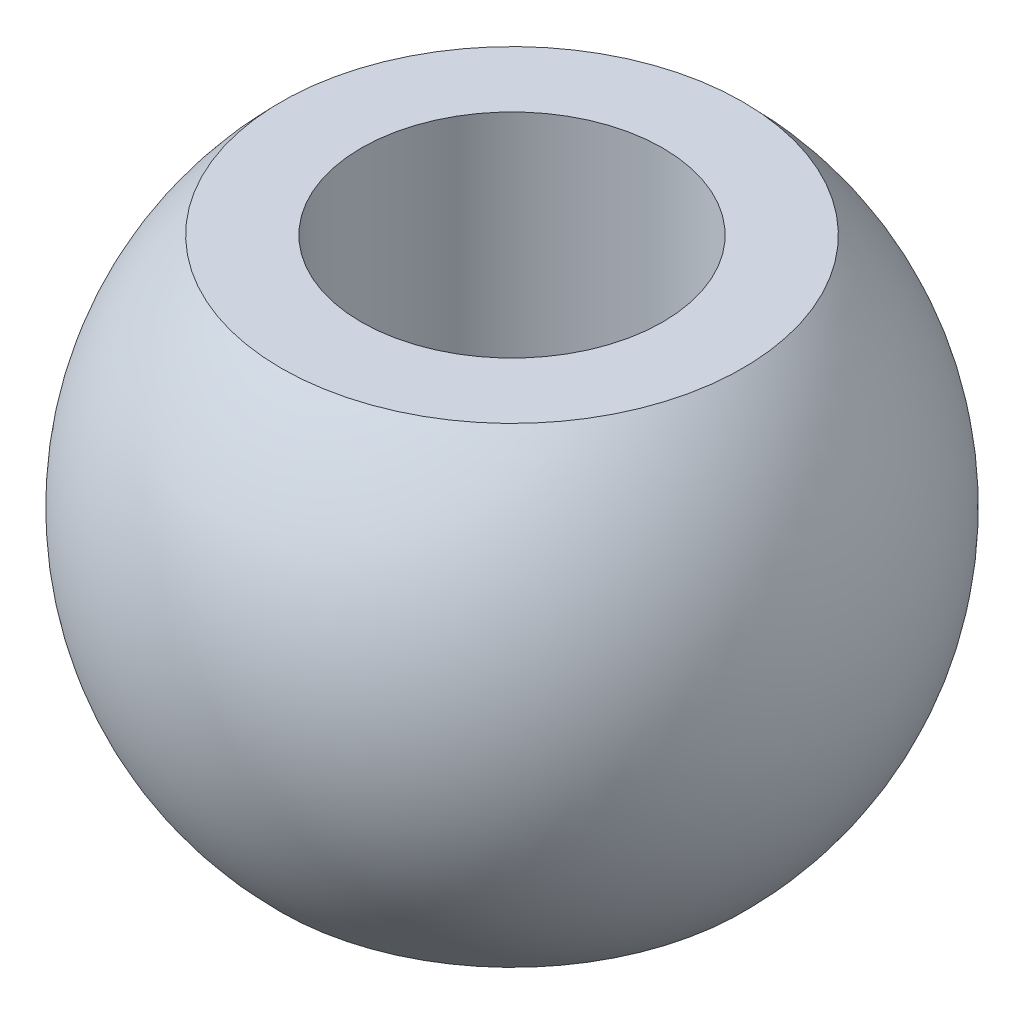
ISO-10303-21;
HEADER;
FILE_DESCRIPTION(('STEP AP214'),'2;1');
FILE_NAME('part.step','',(''),(''),'','','');
FILE_SCHEMA(('AUTOMOTIVE_DESIGN { 1 0 10303 214 1 1 1 1 }'));
ENDSEC;
DATA;
#1=APPLICATION_CONTEXT('core data for automotive mechanical design processes');
#2=APPLICATION_PROTOCOL_DEFINITION('international standard','automotive_design',2000,#1);
#3=PRODUCT_CONTEXT('',#1,'mechanical');
#4=PRODUCT('Part','Part','',(#3));
#5=PRODUCT_RELATED_PRODUCT_CATEGORY('part','',(#4));
#6=PRODUCT_DEFINITION_FORMATION('','',#4);
#7=PRODUCT_DEFINITION_CONTEXT('part definition',#1,'design');
#8=PRODUCT_DEFINITION('design','',#6,#7);
#9=PRODUCT_DEFINITION_SHAPE('','',#8);
#10=(LENGTH_UNIT() NAMED_UNIT(*) SI_UNIT(.MILLI.,.METRE.));
#11=(NAMED_UNIT(*) PLANE_ANGLE_UNIT() SI_UNIT($,.RADIAN.));
#12=(NAMED_UNIT(*) SI_UNIT($,.STERADIAN.) SOLID_ANGLE_UNIT());
#13=UNCERTAINTY_MEASURE_WITH_UNIT(LENGTH_MEASURE(1.E-05),#10,'distance_accuracy_value','');
#14=(GEOMETRIC_REPRESENTATION_CONTEXT(3) GLOBAL_UNCERTAINTY_ASSIGNED_CONTEXT((#13)) GLOBAL_UNIT_ASSIGNED_CONTEXT((#10,
#11,#12)) REPRESENTATION_CONTEXT('',''));
#15=CARTESIAN_POINT('',(0.,0.,0.));
#16=DIRECTION('',(0.,0.,1.));
#17=DIRECTION('',(1.,0.,0.));
#18=AXIS2_PLACEMENT_3D('',#15,#16,#17);
#19=CARTESIAN_POINT('',(0.,2.5,0.));
#20=DIRECTION('',(0.,-1.,0.));
#21=DIRECTION('',(0.,0.,-1.));
#22=AXIS2_PLACEMENT_3D('',#19,#20,#21);
#23=PLANE('',#22);
#24=CARTESIAN_POINT('',(0.,2.5,0.));
#25=DIRECTION('',(0.,-1.,0.));
#26=DIRECTION('',(0.,0.,-1.));
#27=AXIS2_PLACEMENT_3D('',#24,#25,#26);
#28=CIRCLE('',#27,1.6);
#29=CARTESIAN_POINT('',(0.,2.5,-1.6));
#30=VERTEX_POINT('',#29);
#31=EDGE_CURVE('E34',#30,#30,#28,.T.);
#32=ORIENTED_EDGE('',*,*,#31,.T.);
#33=EDGE_LOOP('',(#32));
#34=FACE_BOUND('',#33,.T.);
#35=CARTESIAN_POINT('',(0.,2.5,0.));
#36=DIRECTION('',(0.,1.,0.));
#37=DIRECTION('',(0.,0.,1.));
#38=AXIS2_PLACEMENT_3D('',#35,#36,#37);
#39=CIRCLE('',#38,2.44948974278318);
#40=CARTESIAN_POINT('',(0.,2.5,-2.44948974278318));
#41=VERTEX_POINT('',#40);
#42=EDGE_CURVE('E38',#41,#41,#39,.T.);
#43=ORIENTED_EDGE('',*,*,#42,.T.);
#44=EDGE_LOOP('',(#43));
#45=FACE_BOUND('',#44,.T.);
#46=ADVANCED_FACE('F31',(#34,#45),#23,.F.);
#47=CARTESIAN_POINT('',(0.,-2.5,0.));
#48=DIRECTION('',(0.,1.,0.));
#49=DIRECTION('',(0.,0.,1.));
#50=AXIS2_PLACEMENT_3D('',#47,#48,#49);
#51=PLANE('',#50);
#52=CARTESIAN_POINT('',(0.,-2.5,0.));
#53=DIRECTION('',(0.,1.,0.));
#54=DIRECTION('',(0.,0.,1.));
#55=AXIS2_PLACEMENT_3D('',#52,#53,#54);
#56=CIRCLE('',#55,1.6);
#57=CARTESIAN_POINT('',(0.,-2.5,1.6));
#58=VERTEX_POINT('',#57);
#59=EDGE_CURVE('E42',#58,#58,#56,.T.);
#60=ORIENTED_EDGE('',*,*,#59,.T.);
#61=EDGE_LOOP('',(#60));
#62=FACE_BOUND('',#61,.T.);
#63=CARTESIAN_POINT('',(0.,-2.5,0.));
#64=DIRECTION('',(0.,1.,0.));
#65=DIRECTION('',(0.,0.,1.));
#66=AXIS2_PLACEMENT_3D('',#63,#64,#65);
#67=CIRCLE('',#66,2.44948974278318);
#68=CARTESIAN_POINT('',(0.,-2.5,-2.44948974278318));
#69=VERTEX_POINT('',#68);
#70=EDGE_CURVE('E10',#69,#69,#67,.T.);
#71=ORIENTED_EDGE('',*,*,#70,.F.);
#72=EDGE_LOOP('',(#71));
#73=FACE_BOUND('',#72,.T.);
#74=ADVANCED_FACE('F61',(#62,#73),#51,.F.);
#75=CARTESIAN_POINT('',(0.,0.,0.));
#76=DIRECTION('',(0.,1.,0.));
#77=DIRECTION('',(0.,0.,-1.));
#78=AXIS2_PLACEMENT_3D('',#75,#76,#77);
#79=SPHERICAL_SURFACE('',#78,3.5);
#80=CARTESIAN_POINT('',(0.,2.5,-2.44948974278318));
#81=CARTESIAN_POINT('',(0.,2.45940042729926,-2.49092833589032));
#82=CARTESIAN_POINT('',(0.,2.41776888943607,-2.53135565940199));
#83=CARTESIAN_POINT('',(0.,2.33254861595913,-2.61009195755726));
#84=CARTESIAN_POINT('',(0.,2.28895988034539,-2.64840093220087));
#85=CARTESIAN_POINT('',(0.,2.19993194394171,-2.7228047229429));
#86=CARTESIAN_POINT('',(0.,2.15449274315178,-2.75889953904133));
#87=CARTESIAN_POINT('',(0.,2.06187647991065,-2.82878607978261));
#88=CARTESIAN_POINT('',(0.,2.01469941745945,-2.86257780442546));
#89=CARTESIAN_POINT('',(0.,1.9187239831732,-2.92777454680114));
#90=CARTESIAN_POINT('',(0.,1.86992561133813,-2.95917956453397));
#91=CARTESIAN_POINT('',(0.,1.77082821165519,-3.01952527852021));
#92=CARTESIAN_POINT('',(0.,1.72052918380732,-3.04846597477361));
#93=CARTESIAN_POINT('',(0.,1.6185548102777,-3.10381149624842));
#94=CARTESIAN_POINT('',(0.,1.56687946459596,-3.13021632146984));
#95=CARTESIAN_POINT('',(0.,1.46228020263442,-3.18042482744877));
#96=CARTESIAN_POINT('',(0.,1.40935628635463,-3.2042285082063));
#97=CARTESIAN_POINT('',(0.,1.30239071521424,-3.24917588013651));
#98=CARTESIAN_POINT('',(0.,1.24834906035365,-3.2703195713092));
#99=CARTESIAN_POINT('',(0.,1.13928160769298,-3.30989469518724));
#100=CARTESIAN_POINT('',(0.,1.08425580989291,-3.32832612789259));
#101=CARTESIAN_POINT('',(0.,0.973356099750612,-3.36243117074657));
#102=CARTESIAN_POINT('',(0.,0.917482187408381,-3.37810478089519));
#103=CARTESIAN_POINT('',(0.,0.805024373224377,-3.40665543215413));
#104=CARTESIAN_POINT('',(0.,0.748440471382603,-3.41953247326445));
#105=CARTESIAN_POINT('',(0.,0.634702558386974,-3.44245815331031));
#106=CARTESIAN_POINT('',(0.,0.577548547233117,-3.45250679224585));
#107=CARTESIAN_POINT('',(0.,0.462811705161676,-3.46975082685769));
#108=CARTESIAN_POINT('',(0.,0.405228874244091,-3.47694622253399));
#109=CARTESIAN_POINT('',(0.,0.289776742271595,-3.48846598300071));
#110=CARTESIAN_POINT('',(0.,0.231907441216684,-3.49279034779113));
#111=CARTESIAN_POINT('',(0.,0.116025426774515,-3.49855735629078));
#112=CARTESIAN_POINT('',(0.,0.0580127133872576,-3.5));
#113=CARTESIAN_POINT('',(0.,-0.0580127133872571,-3.5));
#114=CARTESIAN_POINT('',(0.,-0.116025426774514,-3.49855735629078));
#115=CARTESIAN_POINT('',(0.,-0.231907441216683,-3.49279034779113));
#116=CARTESIAN_POINT('',(0.,-0.289776742271594,-3.48846598300071));
#117=CARTESIAN_POINT('',(0.,-0.40522887424409,-3.47694622253399));
#118=CARTESIAN_POINT('',(0.,-0.462811705161676,-3.46975082685769));
#119=CARTESIAN_POINT('',(0.,-0.577548547233117,-3.45250679224585));
#120=CARTESIAN_POINT('',(0.,-0.634702558386973,-3.44245815331031));
#121=CARTESIAN_POINT('',(0.,-0.748440471382603,-3.41953247326445));
#122=CARTESIAN_POINT('',(0.,-0.805024373224376,-3.40665543215413));
#123=CARTESIAN_POINT('',(0.,-0.91748218740838,-3.37810478089519));
#124=CARTESIAN_POINT('',(0.,-0.973356099750612,-3.36243117074657));
#125=CARTESIAN_POINT('',(0.,-1.08425580989291,-3.32832612789259));
#126=CARTESIAN_POINT('',(0.,-1.13928160769298,-3.30989469518724));
#127=CARTESIAN_POINT('',(0.,-1.24834906035365,-3.2703195713092));
#128=CARTESIAN_POINT('',(0.,-1.30239071521424,-3.24917588013651));
#129=CARTESIAN_POINT('',(0.,-1.40935628635463,-3.2042285082063));
#130=CARTESIAN_POINT('',(0.,-1.46228020263442,-3.18042482744877));
#131=CARTESIAN_POINT('',(0.,-1.56687946459595,-3.13021632146984));
#132=CARTESIAN_POINT('',(0.,-1.6185548102777,-3.10381149624842));
#133=CARTESIAN_POINT('',(0.,-1.72052918380732,-3.04846597477361));
#134=CARTESIAN_POINT('',(0.,-1.77082821165519,-3.0195252785202));
#135=CARTESIAN_POINT('',(0.,-1.86992561133813,-2.95917956453397));
#136=CARTESIAN_POINT('',(0.,-1.9187239831732,-2.92777454680114));
#137=CARTESIAN_POINT('',(0.,-2.01469941745945,-2.86257780442546));
#138=CARTESIAN_POINT('',(0.,-2.06187647991065,-2.82878607978261));
#139=CARTESIAN_POINT('',(0.,-2.15449274315178,-2.75889953904133));
#140=CARTESIAN_POINT('',(0.,-2.19993194394171,-2.7228047229429));
#141=CARTESIAN_POINT('',(0.,-2.28895988034539,-2.64840093220087));
#142=CARTESIAN_POINT('',(0.,-2.33254861595913,-2.61009195755726));
#143=CARTESIAN_POINT('',(0.,-2.41776888943607,-2.53135565940199));
#144=CARTESIAN_POINT('',(0.,-2.45940042729926,-2.49092833589032));
#145=CARTESIAN_POINT('',(0.,-2.5,-2.44948974278318));
#146=B_SPLINE_CURVE_WITH_KNOTS('',3,(#80,#81,#82,#83,#84,#85,#86,#87,#88,#89,#90,#91,#92,#93,
#94,#95,#96,#97,#98,#99,#100,#101,#102,#103,#104,#105,#106,#107,#108,#109,#110,#111,#112,#113,
#114,#115,#116,#117,#118,#119,#120,#121,#122,#123,#124,#125,#126,#127,#128,#129,#130,#131,#132,
#133,#134,#135,#136,#137,#138,#139,#140,#141,#142,#143,#144,#145),.UNSPECIFIED.,.F.,.F.,(4,2,2,
2,2,2,2,2,2,2,2,2,2,2,2,2,2,2,2,2,2,2,2,2,2,2,2,2,2,2,2,2,4),(0.,0.174020216392546,
0.348040432785093,0.522060649177639,0.696080865570186,0.870101081962732,1.04412129835528,
1.21814151474782,1.39216173114037,1.56618194753292,1.74020216392546,1.91422238031801,
2.08824259671056,2.2622628131031,2.43628302949565,2.6103032458882,2.78432346228074,
2.95834367867329,3.13236389506584,3.30638411145838,3.48040432785093,3.65442454424347,
3.82844476063602,4.00246497702857,4.17648519342111,4.35050540981366,4.52452562620621,
4.69854584259875,4.8725660589913,5.04658627538385,5.22060649177639,5.39462670816894,
5.56864692456148),.UNSPECIFIED.);
#147=EDGE_CURVE('BSEAM56',#41,#69,#146,.T.);
#148=ORIENTED_EDGE('',*,*,#42,.F.);
#149=ORIENTED_EDGE('',*,*,#70,.T.);
#150=ORIENTED_EDGE('',*,*,#147,.T.);
#151=ORIENTED_EDGE('',*,*,#147,.F.);
#152=EDGE_LOOP('',(#148,#150,#149,#151));
#153=FACE_BOUND('',#152,.T.);
#154=ADVANCED_FACE('F56',(#153),#79,.T.);
#155=CARTESIAN_POINT('',(0.,3.5,0.));
#156=DIRECTION('',(0.,1.,0.));
#157=DIRECTION('',(0.,0.,1.));
#158=AXIS2_PLACEMENT_3D('',#155,#156,#157);
#159=CYLINDRICAL_SURFACE('',#158,1.6);
#160=ORIENTED_EDGE('',*,*,#31,.F.);
#161=EDGE_LOOP('',(#160));
#162=FACE_BOUND('',#161,.T.);
#163=ORIENTED_EDGE('',*,*,#59,.F.);
#164=EDGE_LOOP('',(#163));
#165=FACE_BOUND('',#164,.T.);
#166=ADVANCED_FACE('F53',(#162,#165),#159,.F.);
#167=CLOSED_SHELL('',(#46,#74,#154,#166));
#168=MANIFOLD_SOLID_BREP('B2',#167);
#169=ADVANCED_BREP_SHAPE_REPRESENTATION('',(#18,#168),#14);
#170=SHAPE_DEFINITION_REPRESENTATION(#9,#169);
ENDSEC;
END-ISO-10303-21;
